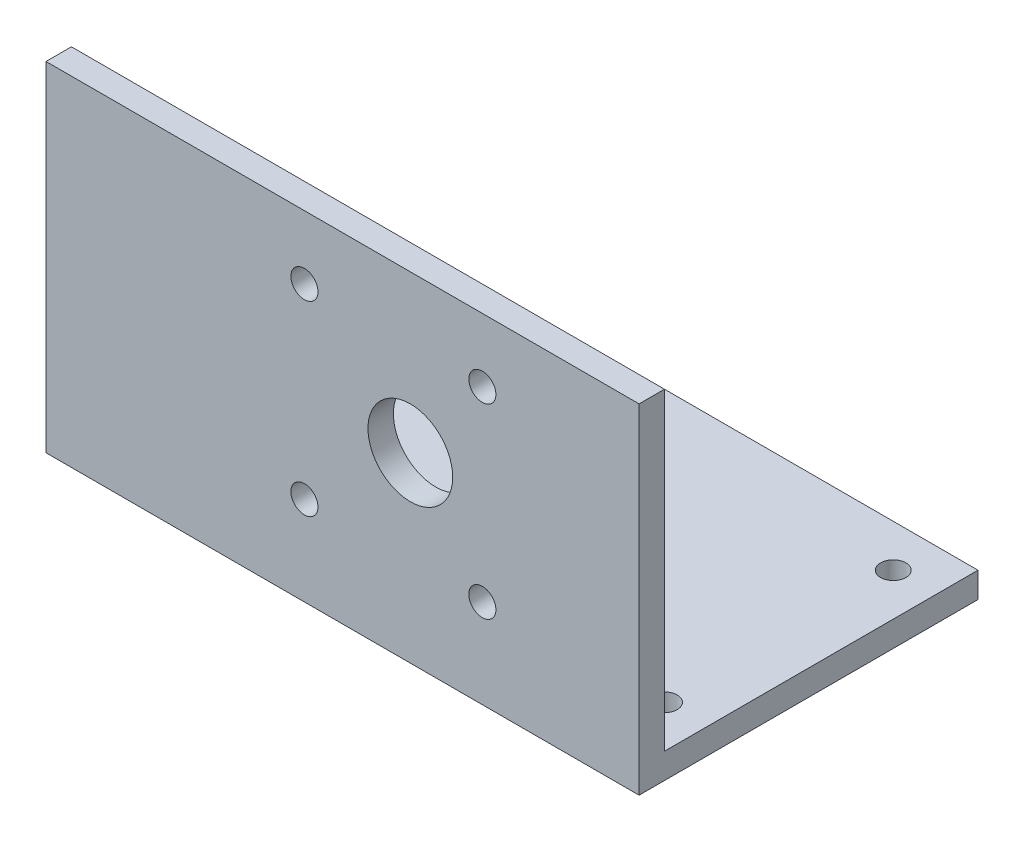
ISO-10303-21;
HEADER;
FILE_DESCRIPTION(('STEP AP214'),'2;1');
FILE_NAME('part.step','',(''),(''),'','','');
FILE_SCHEMA(('AUTOMOTIVE_DESIGN { 1 0 10303 214 1 1 1 1 }'));
ENDSEC;
DATA;
#1=APPLICATION_CONTEXT('core data for automotive mechanical design processes');
#2=APPLICATION_PROTOCOL_DEFINITION('international standard','automotive_design',2000,#1);
#3=PRODUCT_CONTEXT('',#1,'mechanical');
#4=PRODUCT('Part','Part','',(#3));
#5=PRODUCT_RELATED_PRODUCT_CATEGORY('part','',(#4));
#6=PRODUCT_DEFINITION_FORMATION('','',#4);
#7=PRODUCT_DEFINITION_CONTEXT('part definition',#1,'design');
#8=PRODUCT_DEFINITION('design','',#6,#7);
#9=PRODUCT_DEFINITION_SHAPE('','',#8);
#10=(LENGTH_UNIT() NAMED_UNIT(*) SI_UNIT(.MILLI.,.METRE.));
#11=(NAMED_UNIT(*) PLANE_ANGLE_UNIT() SI_UNIT($,.RADIAN.));
#12=(NAMED_UNIT(*) SI_UNIT($,.STERADIAN.) SOLID_ANGLE_UNIT());
#13=UNCERTAINTY_MEASURE_WITH_UNIT(LENGTH_MEASURE(1.E-05),#10,'distance_accuracy_value','');
#14=(GEOMETRIC_REPRESENTATION_CONTEXT(3) GLOBAL_UNCERTAINTY_ASSIGNED_CONTEXT((#13)) GLOBAL_UNIT_ASSIGNED_CONTEXT((#10,
#11,#12)) REPRESENTATION_CONTEXT('',''));
#15=CARTESIAN_POINT('',(0.,0.,0.));
#16=DIRECTION('',(0.,0.,1.));
#17=DIRECTION('',(1.,0.,0.));
#18=AXIS2_PLACEMENT_3D('',#15,#16,#17);
#19=CARTESIAN_POINT('',(70.,-17.,-20.));
#20=DIRECTION('',(0.,0.,1.));
#21=DIRECTION('',(0.,-1.,0.));
#22=AXIS2_PLACEMENT_3D('',#19,#20,#21);
#23=PLANE('',#22);
#24=DIRECTION('',(0.,1.,0.));
#25=VECTOR('',#24,1.);
#26=CARTESIAN_POINT('',(0.,-17.,-20.));
#27=LINE('',#26,#25);
#28=CARTESIAN_POINT('',(0.,-20.,-20.));
#29=VERTEX_POINT('',#28);
#30=CARTESIAN_POINT('',(0.,-17.,-20.));
#31=VERTEX_POINT('',#30);
#32=EDGE_CURVE('E119',#29,#31,#27,.T.);
#33=ORIENTED_EDGE('',*,*,#32,.T.);
#34=DIRECTION('',(-1.,0.,0.));
#35=VECTOR('',#34,1.);
#36=CARTESIAN_POINT('',(70.,-17.,-20.));
#37=LINE('',#36,#35);
#38=CARTESIAN_POINT('',(70.,-17.,-20.));
#39=VERTEX_POINT('',#38);
#40=EDGE_CURVE('E11',#39,#31,#37,.T.);
#41=ORIENTED_EDGE('',*,*,#40,.F.);
#42=DIRECTION('',(0.,1.,0.));
#43=VECTOR('',#42,1.);
#44=CARTESIAN_POINT('',(70.,-17.,-20.));
#45=LINE('',#44,#43);
#46=CARTESIAN_POINT('',(70.,-20.,-20.));
#47=VERTEX_POINT('',#46);
#48=EDGE_CURVE('E130',#47,#39,#45,.T.);
#49=ORIENTED_EDGE('',*,*,#48,.F.);
#50=DIRECTION('',(-1.,0.,0.));
#51=VECTOR('',#50,1.);
#52=CARTESIAN_POINT('',(70.,-20.,-20.));
#53=LINE('',#52,#51);
#54=EDGE_CURVE('E115',#47,#29,#53,.T.);
#55=ORIENTED_EDGE('',*,*,#54,.T.);
#56=EDGE_LOOP('',(#33,#41,#49,#55));
#57=FACE_BOUND('',#56,.T.);
#58=ADVANCED_FACE('F35',(#57),#23,.F.);
#59=CARTESIAN_POINT('',(70.,-17.,-20.));
#60=DIRECTION('',(0.,-1.,0.));
#61=DIRECTION('',(0.,0.,-1.));
#62=AXIS2_PLACEMENT_3D('',#59,#60,#61);
#63=PLANE('',#62);
#64=CARTESIAN_POINT('',(5.,-17.,12.));
#65=DIRECTION('',(0.,1.,0.));
#66=DIRECTION('',(0.,0.,-1.));
#67=AXIS2_PLACEMENT_3D('',#64,#65,#66);
#68=CIRCLE('',#67,1.5);
#69=CARTESIAN_POINT('',(5.,-17.,13.5));
#70=VERTEX_POINT('',#69);
#71=EDGE_CURVE('E296',#70,#70,#68,.T.);
#72=ORIENTED_EDGE('',*,*,#71,.F.);
#73=EDGE_LOOP('',(#72));
#74=FACE_BOUND('',#73,.T.);
#75=CARTESIAN_POINT('',(5.,-17.,-15.));
#76=DIRECTION('',(0.,1.,0.));
#77=DIRECTION('',(0.,0.,-1.));
#78=AXIS2_PLACEMENT_3D('',#75,#76,#77);
#79=CIRCLE('',#78,1.5);
#80=CARTESIAN_POINT('',(5.,-17.,-13.5));
#81=VERTEX_POINT('',#80);
#82=EDGE_CURVE('E298',#81,#81,#79,.T.);
#83=ORIENTED_EDGE('',*,*,#82,.F.);
#84=EDGE_LOOP('',(#83));
#85=FACE_BOUND('',#84,.T.);
#86=CARTESIAN_POINT('',(65.,-17.,-15.));
#87=DIRECTION('',(0.,1.,0.));
#88=DIRECTION('',(0.,0.,1.));
#89=AXIS2_PLACEMENT_3D('',#86,#87,#88);
#90=CIRCLE('',#89,1.5);
#91=CARTESIAN_POINT('',(65.,-17.,-13.5));
#92=VERTEX_POINT('',#91);
#93=EDGE_CURVE('E306',#92,#92,#90,.T.);
#94=ORIENTED_EDGE('',*,*,#93,.F.);
#95=EDGE_LOOP('',(#94));
#96=FACE_BOUND('',#95,.T.);
#97=CARTESIAN_POINT('',(65.,-17.,12.));
#98=DIRECTION('',(0.,1.,0.));
#99=DIRECTION('',(0.,0.,1.));
#100=AXIS2_PLACEMENT_3D('',#97,#98,#99);
#101=CIRCLE('',#100,1.5);
#102=CARTESIAN_POINT('',(65.,-17.,13.5));
#103=VERTEX_POINT('',#102);
#104=EDGE_CURVE('E312',#103,#103,#101,.T.);
#105=ORIENTED_EDGE('',*,*,#104,.F.);
#106=EDGE_LOOP('',(#105));
#107=FACE_BOUND('',#106,.T.);
#108=DIRECTION('',(0.,0.,1.));
#109=VECTOR('',#108,1.);
#110=CARTESIAN_POINT('',(0.,-17.,-20.));
#111=LINE('',#110,#109);
#112=CARTESIAN_POINT('',(0.,-17.,17.));
#113=VERTEX_POINT('',#112);
#114=EDGE_CURVE('E122',#31,#113,#111,.T.);
#115=ORIENTED_EDGE('',*,*,#114,.T.);
#116=DIRECTION('',(-1.,0.,0.));
#117=VECTOR('',#116,1.);
#118=CARTESIAN_POINT('',(70.,-17.,17.));
#119=LINE('',#118,#117);
#120=CARTESIAN_POINT('',(70.,-17.,17.));
#121=VERTEX_POINT('',#120);
#122=EDGE_CURVE('E43',#121,#113,#119,.T.);
#123=ORIENTED_EDGE('',*,*,#122,.F.);
#124=DIRECTION('',(0.,0.,1.));
#125=VECTOR('',#124,1.);
#126=CARTESIAN_POINT('',(70.,-17.,-20.));
#127=LINE('',#126,#125);
#128=EDGE_CURVE('E88',#39,#121,#127,.T.);
#129=ORIENTED_EDGE('',*,*,#128,.F.);
#130=ORIENTED_EDGE('',*,*,#40,.T.);
#131=EDGE_LOOP('',(#115,#123,#129,#130));
#132=FACE_BOUND('',#131,.T.);
#133=ADVANCED_FACE('F160',(#74,#85,#96,#107,#132),#63,.F.);
#134=CARTESIAN_POINT('',(70.,20.,17.));
#135=DIRECTION('',(0.,0.,1.));
#136=DIRECTION('',(0.,-1.,0.));
#137=AXIS2_PLACEMENT_3D('',#134,#135,#136);
#138=PLANE('',#137);
#139=CARTESIAN_POINT('',(51.5,-9.50000000000001,17.));
#140=DIRECTION('',(0.,0.,1.));
#141=DIRECTION('',(0.,-1.,0.));
#142=AXIS2_PLACEMENT_3D('',#139,#140,#141);
#143=CIRCLE('',#142,1.6);
#144=CARTESIAN_POINT('',(51.5,-11.1,17.));
#145=VERTEX_POINT('',#144);
#146=EDGE_CURVE('E321',#145,#145,#143,.F.);
#147=ORIENTED_EDGE('',*,*,#146,.F.);
#148=EDGE_LOOP('',(#147));
#149=FACE_BOUND('',#148,.T.);
#150=CARTESIAN_POINT('',(30.5,-9.50000000000001,17.));
#151=DIRECTION('',(0.,0.,1.));
#152=DIRECTION('',(0.,-1.,0.));
#153=AXIS2_PLACEMENT_3D('',#150,#151,#152);
#154=CIRCLE('',#153,1.6);
#155=CARTESIAN_POINT('',(30.5,-11.1,17.));
#156=VERTEX_POINT('',#155);
#157=EDGE_CURVE('E327',#156,#156,#154,.F.);
#158=ORIENTED_EDGE('',*,*,#157,.F.);
#159=EDGE_LOOP('',(#158));
#160=FACE_BOUND('',#159,.T.);
#161=CARTESIAN_POINT('',(30.5,12.5,17.));
#162=DIRECTION('',(0.,0.,1.));
#163=DIRECTION('',(0.,-1.,0.));
#164=AXIS2_PLACEMENT_3D('',#161,#162,#163);
#165=CIRCLE('',#164,1.6);
#166=CARTESIAN_POINT('',(30.5,10.9,17.));
#167=VERTEX_POINT('',#166);
#168=EDGE_CURVE('E333',#167,#167,#165,.F.);
#169=ORIENTED_EDGE('',*,*,#168,.F.);
#170=EDGE_LOOP('',(#169));
#171=FACE_BOUND('',#170,.T.);
#172=CARTESIAN_POINT('',(51.5,12.5,17.));
#173=DIRECTION('',(0.,0.,1.));
#174=DIRECTION('',(0.,-1.,0.));
#175=AXIS2_PLACEMENT_3D('',#172,#173,#174);
#176=CIRCLE('',#175,1.6);
#177=CARTESIAN_POINT('',(51.5,10.9,17.));
#178=VERTEX_POINT('',#177);
#179=EDGE_CURVE('E339',#178,#178,#176,.F.);
#180=ORIENTED_EDGE('',*,*,#179,.F.);
#181=EDGE_LOOP('',(#180));
#182=FACE_BOUND('',#181,.T.);
#183=CARTESIAN_POINT('',(43.,1.49999999999999,17.));
#184=DIRECTION('',(0.,0.,1.));
#185=DIRECTION('',(0.,-1.,0.));
#186=AXIS2_PLACEMENT_3D('',#183,#184,#185);
#187=CIRCLE('',#186,5.);
#188=CARTESIAN_POINT('',(43.,-3.50000000000001,17.));
#189=VERTEX_POINT('',#188);
#190=EDGE_CURVE('E123',#189,#189,#187,.F.);
#191=ORIENTED_EDGE('',*,*,#190,.F.);
#192=EDGE_LOOP('',(#191));
#193=FACE_BOUND('',#192,.T.);
#194=DIRECTION('',(0.,1.,0.));
#195=VECTOR('',#194,1.);
#196=CARTESIAN_POINT('',(0.,20.,17.));
#197=LINE('',#196,#195);
#198=CARTESIAN_POINT('',(0.,20.,17.));
#199=VERTEX_POINT('',#198);
#200=EDGE_CURVE('E125',#113,#199,#197,.T.);
#201=ORIENTED_EDGE('',*,*,#200,.T.);
#202=DIRECTION('',(-1.,0.,0.));
#203=VECTOR('',#202,1.);
#204=CARTESIAN_POINT('',(70.,20.,17.));
#205=LINE('',#204,#203);
#206=CARTESIAN_POINT('',(70.,20.,17.));
#207=VERTEX_POINT('',#206);
#208=EDGE_CURVE('E110',#207,#199,#205,.T.);
#209=ORIENTED_EDGE('',*,*,#208,.F.);
#210=DIRECTION('',(0.,1.,0.));
#211=VECTOR('',#210,1.);
#212=CARTESIAN_POINT('',(70.,20.,17.));
#213=LINE('',#212,#211);
#214=EDGE_CURVE('E101',#121,#207,#213,.T.);
#215=ORIENTED_EDGE('',*,*,#214,.F.);
#216=ORIENTED_EDGE('',*,*,#122,.T.);
#217=EDGE_LOOP('',(#201,#209,#215,#216));
#218=FACE_BOUND('',#217,.T.);
#219=ADVANCED_FACE('F136',(#149,#160,#171,#182,#193,#218),#138,.F.);
#220=CARTESIAN_POINT('',(70.,20.,20.));
#221=DIRECTION('',(0.,-1.,0.));
#222=DIRECTION('',(0.,0.,-1.));
#223=AXIS2_PLACEMENT_3D('',#220,#221,#222);
#224=PLANE('',#223);
#225=DIRECTION('',(0.,0.,1.));
#226=VECTOR('',#225,1.);
#227=CARTESIAN_POINT('',(0.,20.,20.));
#228=LINE('',#227,#226);
#229=CARTESIAN_POINT('',(0.,20.,20.));
#230=VERTEX_POINT('',#229);
#231=EDGE_CURVE('E109',#199,#230,#228,.T.);
#232=ORIENTED_EDGE('',*,*,#231,.T.);
#233=DIRECTION('',(-1.,0.,0.));
#234=VECTOR('',#233,1.);
#235=CARTESIAN_POINT('',(70.,20.,20.));
#236=LINE('',#235,#234);
#237=CARTESIAN_POINT('',(70.,20.,20.));
#238=VERTEX_POINT('',#237);
#239=EDGE_CURVE('E106',#238,#230,#236,.T.);
#240=ORIENTED_EDGE('',*,*,#239,.F.);
#241=DIRECTION('',(0.,0.,1.));
#242=VECTOR('',#241,1.);
#243=CARTESIAN_POINT('',(70.,20.,20.));
#244=LINE('',#243,#242);
#245=EDGE_CURVE('E95',#207,#238,#244,.T.);
#246=ORIENTED_EDGE('',*,*,#245,.F.);
#247=ORIENTED_EDGE('',*,*,#208,.T.);
#248=EDGE_LOOP('',(#232,#240,#246,#247));
#249=FACE_BOUND('',#248,.T.);
#250=ADVANCED_FACE('F107',(#249),#224,.F.);
#251=CARTESIAN_POINT('',(70.,20.,20.));
#252=DIRECTION('',(0.,0.,-1.));
#253=DIRECTION('',(0.,1.,0.));
#254=AXIS2_PLACEMENT_3D('',#251,#252,#253);
#255=PLANE('',#254);
#256=CARTESIAN_POINT('',(51.5,-9.50000000000001,20.));
#257=DIRECTION('',(0.,0.,1.));
#258=DIRECTION('',(1.,0.,0.));
#259=AXIS2_PLACEMENT_3D('',#256,#257,#258);
#260=CIRCLE('',#259,1.6);
#261=CARTESIAN_POINT('',(53.1,-9.50000000000001,20.));
#262=VERTEX_POINT('',#261);
#263=EDGE_CURVE('E318',#262,#262,#260,.T.);
#264=ORIENTED_EDGE('',*,*,#263,.F.);
#265=EDGE_LOOP('',(#264));
#266=FACE_BOUND('',#265,.T.);
#267=CARTESIAN_POINT('',(30.5,-9.50000000000001,20.));
#268=DIRECTION('',(0.,0.,1.));
#269=DIRECTION('',(1.,0.,0.));
#270=AXIS2_PLACEMENT_3D('',#267,#268,#269);
#271=CIRCLE('',#270,1.6);
#272=CARTESIAN_POINT('',(32.1,-9.50000000000001,20.));
#273=VERTEX_POINT('',#272);
#274=EDGE_CURVE('E324',#273,#273,#271,.T.);
#275=ORIENTED_EDGE('',*,*,#274,.F.);
#276=EDGE_LOOP('',(#275));
#277=FACE_BOUND('',#276,.T.);
#278=CARTESIAN_POINT('',(30.5,12.5,20.));
#279=DIRECTION('',(0.,0.,1.));
#280=DIRECTION('',(1.,0.,0.));
#281=AXIS2_PLACEMENT_3D('',#278,#279,#280);
#282=CIRCLE('',#281,1.6);
#283=CARTESIAN_POINT('',(32.1,12.5,20.));
#284=VERTEX_POINT('',#283);
#285=EDGE_CURVE('E330',#284,#284,#282,.T.);
#286=ORIENTED_EDGE('',*,*,#285,.F.);
#287=EDGE_LOOP('',(#286));
#288=FACE_BOUND('',#287,.T.);
#289=CARTESIAN_POINT('',(51.5,12.5,20.));
#290=DIRECTION('',(0.,0.,1.));
#291=DIRECTION('',(1.,0.,0.));
#292=AXIS2_PLACEMENT_3D('',#289,#290,#291);
#293=CIRCLE('',#292,1.6);
#294=CARTESIAN_POINT('',(53.1,12.5,20.));
#295=VERTEX_POINT('',#294);
#296=EDGE_CURVE('E336',#295,#295,#293,.T.);
#297=ORIENTED_EDGE('',*,*,#296,.F.);
#298=EDGE_LOOP('',(#297));
#299=FACE_BOUND('',#298,.T.);
#300=CARTESIAN_POINT('',(43.,1.49999999999999,20.));
#301=DIRECTION('',(0.,0.,1.));
#302=DIRECTION('',(1.,0.,0.));
#303=AXIS2_PLACEMENT_3D('',#300,#301,#302);
#304=CIRCLE('',#303,5.);
#305=CARTESIAN_POINT('',(48.,1.49999999999999,20.));
#306=VERTEX_POINT('',#305);
#307=EDGE_CURVE('E342',#306,#306,#304,.T.);
#308=ORIENTED_EDGE('',*,*,#307,.F.);
#309=EDGE_LOOP('',(#308));
#310=FACE_BOUND('',#309,.T.);
#311=DIRECTION('',(0.,-1.,0.));
#312=VECTOR('',#311,1.);
#313=CARTESIAN_POINT('',(0.,20.,20.));
#314=LINE('',#313,#312);
#315=CARTESIAN_POINT('',(0.,-20.,20.));
#316=VERTEX_POINT('',#315);
#317=EDGE_CURVE('E74',#230,#316,#314,.T.);
#318=ORIENTED_EDGE('',*,*,#317,.T.);
#319=DIRECTION('',(-1.,0.,0.));
#320=VECTOR('',#319,1.);
#321=CARTESIAN_POINT('',(70.,-20.,20.));
#322=LINE('',#321,#320);
#323=CARTESIAN_POINT('',(70.,-20.,20.));
#324=VERTEX_POINT('',#323);
#325=EDGE_CURVE('E111',#324,#316,#322,.T.);
#326=ORIENTED_EDGE('',*,*,#325,.F.);
#327=DIRECTION('',(0.,-1.,0.));
#328=VECTOR('',#327,1.);
#329=CARTESIAN_POINT('',(70.,20.,20.));
#330=LINE('',#329,#328);
#331=EDGE_CURVE('E99',#238,#324,#330,.T.);
#332=ORIENTED_EDGE('',*,*,#331,.F.);
#333=ORIENTED_EDGE('',*,*,#239,.T.);
#334=EDGE_LOOP('',(#318,#326,#332,#333));
#335=FACE_BOUND('',#334,.T.);
#336=ADVANCED_FACE('F113',(#266,#277,#288,#299,#310,#335),#255,.F.);
#337=CARTESIAN_POINT('',(70.,-20.,20.));
#338=DIRECTION('',(0.,1.,0.));
#339=DIRECTION('',(0.,0.,1.));
#340=AXIS2_PLACEMENT_3D('',#337,#338,#339);
#341=PLANE('',#340);
#342=CARTESIAN_POINT('',(5.,-20.,12.));
#343=DIRECTION('',(0.,1.,0.));
#344=DIRECTION('',(0.,0.,1.));
#345=AXIS2_PLACEMENT_3D('',#342,#343,#344);
#346=CIRCLE('',#345,1.5);
#347=CARTESIAN_POINT('',(5.,-20.,13.5));
#348=VERTEX_POINT('',#347);
#349=EDGE_CURVE('E294',#348,#348,#346,.F.);
#350=ORIENTED_EDGE('',*,*,#349,.F.);
#351=EDGE_LOOP('',(#350));
#352=FACE_BOUND('',#351,.T.);
#353=CARTESIAN_POINT('',(5.,-20.,-15.));
#354=DIRECTION('',(0.,1.,0.));
#355=DIRECTION('',(0.,0.,1.));
#356=AXIS2_PLACEMENT_3D('',#353,#354,#355);
#357=CIRCLE('',#356,1.5);
#358=CARTESIAN_POINT('',(5.,-20.,-13.5));
#359=VERTEX_POINT('',#358);
#360=EDGE_CURVE('E303',#359,#359,#357,.F.);
#361=ORIENTED_EDGE('',*,*,#360,.F.);
#362=EDGE_LOOP('',(#361));
#363=FACE_BOUND('',#362,.T.);
#364=CARTESIAN_POINT('',(65.,-20.,-15.));
#365=DIRECTION('',(0.,1.,0.));
#366=DIRECTION('',(0.,0.,1.));
#367=AXIS2_PLACEMENT_3D('',#364,#365,#366);
#368=CIRCLE('',#367,1.5);
#369=CARTESIAN_POINT('',(65.,-20.,-13.5));
#370=VERTEX_POINT('',#369);
#371=EDGE_CURVE('E309',#370,#370,#368,.F.);
#372=ORIENTED_EDGE('',*,*,#371,.F.);
#373=EDGE_LOOP('',(#372));
#374=FACE_BOUND('',#373,.T.);
#375=CARTESIAN_POINT('',(65.,-20.,12.));
#376=DIRECTION('',(0.,1.,0.));
#377=DIRECTION('',(0.,0.,1.));
#378=AXIS2_PLACEMENT_3D('',#375,#376,#377);
#379=CIRCLE('',#378,1.5);
#380=CARTESIAN_POINT('',(65.,-20.,13.5));
#381=VERTEX_POINT('',#380);
#382=EDGE_CURVE('E315',#381,#381,#379,.F.);
#383=ORIENTED_EDGE('',*,*,#382,.F.);
#384=EDGE_LOOP('',(#383));
#385=FACE_BOUND('',#384,.T.);
#386=DIRECTION('',(0.,0.,-1.));
#387=VECTOR('',#386,1.);
#388=CARTESIAN_POINT('',(0.,-20.,20.));
#389=LINE('',#388,#387);
#390=EDGE_CURVE('E80',#316,#29,#389,.T.);
#391=ORIENTED_EDGE('',*,*,#390,.T.);
#392=ORIENTED_EDGE('',*,*,#54,.F.);
#393=DIRECTION('',(0.,0.,-1.));
#394=VECTOR('',#393,1.);
#395=CARTESIAN_POINT('',(70.,-20.,20.));
#396=LINE('',#395,#394);
#397=EDGE_CURVE('E51',#324,#47,#396,.T.);
#398=ORIENTED_EDGE('',*,*,#397,.F.);
#399=ORIENTED_EDGE('',*,*,#325,.T.);
#400=EDGE_LOOP('',(#391,#392,#398,#399));
#401=FACE_BOUND('',#400,.T.);
#402=ADVANCED_FACE('F143',(#352,#363,#374,#385,#401),#341,.F.);
#403=CARTESIAN_POINT('',(70.,0.,0.));
#404=DIRECTION('',(1.,0.,0.));
#405=DIRECTION('',(0.,0.,-1.));
#406=AXIS2_PLACEMENT_3D('',#403,#404,#405);
#407=PLANE('',#406);
#408=ORIENTED_EDGE('',*,*,#48,.T.);
#409=ORIENTED_EDGE('',*,*,#128,.T.);
#410=ORIENTED_EDGE('',*,*,#214,.T.);
#411=ORIENTED_EDGE('',*,*,#245,.T.);
#412=ORIENTED_EDGE('',*,*,#331,.T.);
#413=ORIENTED_EDGE('',*,*,#397,.T.);
#414=EDGE_LOOP('',(#408,#409,#410,#411,#412,#413));
#415=FACE_BOUND('',#414,.T.);
#416=ADVANCED_FACE('F97',(#415),#407,.T.);
#417=CARTESIAN_POINT('',(0.,0.,0.));
#418=DIRECTION('',(1.,0.,0.));
#419=DIRECTION('',(0.,0.,-1.));
#420=AXIS2_PLACEMENT_3D('',#417,#418,#419);
#421=PLANE('',#420);
#422=ORIENTED_EDGE('',*,*,#32,.F.);
#423=ORIENTED_EDGE('',*,*,#390,.F.);
#424=ORIENTED_EDGE('',*,*,#317,.F.);
#425=ORIENTED_EDGE('',*,*,#231,.F.);
#426=ORIENTED_EDGE('',*,*,#200,.F.);
#427=ORIENTED_EDGE('',*,*,#114,.F.);
#428=EDGE_LOOP('',(#422,#423,#424,#425,#426,#427));
#429=FACE_BOUND('',#428,.T.);
#430=ADVANCED_FACE('F139',(#429),#421,.F.);
#431=CARTESIAN_POINT('',(43.,1.49999999999999,2.85786437626906));
#432=DIRECTION('',(0.,0.,1.));
#433=DIRECTION('',(1.,0.,0.));
#434=AXIS2_PLACEMENT_3D('',#431,#432,#433);
#435=CYLINDRICAL_SURFACE('',#434,5.);
#436=ORIENTED_EDGE('',*,*,#190,.T.);
#437=EDGE_LOOP('',(#436));
#438=FACE_BOUND('',#437,.T.);
#439=ORIENTED_EDGE('',*,*,#307,.T.);
#440=EDGE_LOOP('',(#439));
#441=FACE_BOUND('',#440,.T.);
#442=ADVANCED_FACE('F200',(#438,#441),#435,.F.);
#443=CARTESIAN_POINT('',(51.5,12.5,2.85786437626906));
#444=DIRECTION('',(0.,0.,1.));
#445=DIRECTION('',(1.,0.,0.));
#446=AXIS2_PLACEMENT_3D('',#443,#444,#445);
#447=CYLINDRICAL_SURFACE('',#446,1.6);
#448=ORIENTED_EDGE('',*,*,#179,.T.);
#449=EDGE_LOOP('',(#448));
#450=FACE_BOUND('',#449,.T.);
#451=ORIENTED_EDGE('',*,*,#296,.T.);
#452=EDGE_LOOP('',(#451));
#453=FACE_BOUND('',#452,.T.);
#454=ADVANCED_FACE('F205',(#450,#453),#447,.F.);
#455=CARTESIAN_POINT('',(30.5,12.5,2.85786437626906));
#456=DIRECTION('',(0.,0.,1.));
#457=DIRECTION('',(1.,0.,0.));
#458=AXIS2_PLACEMENT_3D('',#455,#456,#457);
#459=CYLINDRICAL_SURFACE('',#458,1.6);
#460=ORIENTED_EDGE('',*,*,#168,.T.);
#461=EDGE_LOOP('',(#460));
#462=FACE_BOUND('',#461,.T.);
#463=ORIENTED_EDGE('',*,*,#285,.T.);
#464=EDGE_LOOP('',(#463));
#465=FACE_BOUND('',#464,.T.);
#466=ADVANCED_FACE('F213',(#462,#465),#459,.F.);
#467=CARTESIAN_POINT('',(30.5,-9.50000000000001,2.85786437626906));
#468=DIRECTION('',(0.,0.,1.));
#469=DIRECTION('',(1.,0.,0.));
#470=AXIS2_PLACEMENT_3D('',#467,#468,#469);
#471=CYLINDRICAL_SURFACE('',#470,1.6);
#472=ORIENTED_EDGE('',*,*,#157,.T.);
#473=EDGE_LOOP('',(#472));
#474=FACE_BOUND('',#473,.T.);
#475=ORIENTED_EDGE('',*,*,#274,.T.);
#476=EDGE_LOOP('',(#475));
#477=FACE_BOUND('',#476,.T.);
#478=ADVANCED_FACE('F221',(#474,#477),#471,.F.);
#479=CARTESIAN_POINT('',(51.5,-9.50000000000001,2.85786437626906));
#480=DIRECTION('',(0.,0.,1.));
#481=DIRECTION('',(1.,0.,0.));
#482=AXIS2_PLACEMENT_3D('',#479,#480,#481);
#483=CYLINDRICAL_SURFACE('',#482,1.6);
#484=ORIENTED_EDGE('',*,*,#146,.T.);
#485=EDGE_LOOP('',(#484));
#486=FACE_BOUND('',#485,.T.);
#487=ORIENTED_EDGE('',*,*,#263,.T.);
#488=EDGE_LOOP('',(#487));
#489=FACE_BOUND('',#488,.T.);
#490=ADVANCED_FACE('F229',(#486,#489),#483,.F.);
#491=CARTESIAN_POINT('',(65.,-24.2426406871193,12.));
#492=DIRECTION('',(0.,1.,0.));
#493=DIRECTION('',(0.,0.,1.));
#494=AXIS2_PLACEMENT_3D('',#491,#492,#493);
#495=CYLINDRICAL_SURFACE('',#494,1.5);
#496=CARTESIAN_POINT('',(65.,-20.,13.5));
#497=CARTESIAN_POINT('',(65.,-19.96875,13.5));
#498=CARTESIAN_POINT('',(65.,-19.9375,13.5));
#499=CARTESIAN_POINT('',(65.,-19.875,13.5));
#500=CARTESIAN_POINT('',(65.,-19.84375,13.5));
#501=CARTESIAN_POINT('',(65.,-19.78125,13.5));
#502=CARTESIAN_POINT('',(65.,-19.75,13.5));
#503=CARTESIAN_POINT('',(65.,-19.6875,13.5));
#504=CARTESIAN_POINT('',(65.,-19.65625,13.5));
#505=CARTESIAN_POINT('',(65.,-19.59375,13.5));
#506=CARTESIAN_POINT('',(65.,-19.5625,13.5));
#507=CARTESIAN_POINT('',(65.,-19.5,13.5));
#508=CARTESIAN_POINT('',(65.,-19.46875,13.5));
#509=CARTESIAN_POINT('',(65.,-19.40625,13.5));
#510=CARTESIAN_POINT('',(65.,-19.375,13.5));
#511=CARTESIAN_POINT('',(65.,-19.3125,13.5));
#512=CARTESIAN_POINT('',(65.,-19.28125,13.5));
#513=CARTESIAN_POINT('',(65.,-19.21875,13.5));
#514=CARTESIAN_POINT('',(65.,-19.1875,13.5));
#515=CARTESIAN_POINT('',(65.,-19.125,13.5));
#516=CARTESIAN_POINT('',(65.,-19.09375,13.5));
#517=CARTESIAN_POINT('',(65.,-19.03125,13.5));
#518=CARTESIAN_POINT('',(65.,-19.,13.5));
#519=CARTESIAN_POINT('',(65.,-18.9375,13.5));
#520=CARTESIAN_POINT('',(65.,-18.90625,13.5));
#521=CARTESIAN_POINT('',(65.,-18.84375,13.5));
#522=CARTESIAN_POINT('',(65.,-18.8125,13.5));
#523=CARTESIAN_POINT('',(65.,-18.75,13.5));
#524=CARTESIAN_POINT('',(65.,-18.71875,13.5));
#525=CARTESIAN_POINT('',(65.,-18.65625,13.5));
#526=CARTESIAN_POINT('',(65.,-18.625,13.5));
#527=CARTESIAN_POINT('',(65.,-18.5625,13.5));
#528=CARTESIAN_POINT('',(65.,-18.53125,13.5));
#529=CARTESIAN_POINT('',(65.,-18.46875,13.5));
#530=CARTESIAN_POINT('',(65.,-18.4375,13.5));
#531=CARTESIAN_POINT('',(65.,-18.375,13.5));
#532=CARTESIAN_POINT('',(65.,-18.34375,13.5));
#533=CARTESIAN_POINT('',(65.,-18.28125,13.5));
#534=CARTESIAN_POINT('',(65.,-18.25,13.5));
#535=CARTESIAN_POINT('',(65.,-18.1875,13.5));
#536=CARTESIAN_POINT('',(65.,-18.15625,13.5));
#537=CARTESIAN_POINT('',(65.,-18.09375,13.5));
#538=CARTESIAN_POINT('',(65.,-18.0625,13.5));
#539=CARTESIAN_POINT('',(65.,-18.,13.5));
#540=CARTESIAN_POINT('',(65.,-17.96875,13.5));
#541=CARTESIAN_POINT('',(65.,-17.90625,13.5));
#542=CARTESIAN_POINT('',(65.,-17.875,13.5));
#543=CARTESIAN_POINT('',(65.,-17.8125,13.5));
#544=CARTESIAN_POINT('',(65.,-17.78125,13.5));
#545=CARTESIAN_POINT('',(65.,-17.71875,13.5));
#546=CARTESIAN_POINT('',(65.,-17.6875,13.5));
#547=CARTESIAN_POINT('',(65.,-17.625,13.5));
#548=CARTESIAN_POINT('',(65.,-17.59375,13.5));
#549=CARTESIAN_POINT('',(65.,-17.53125,13.5));
#550=CARTESIAN_POINT('',(65.,-17.5,13.5));
#551=CARTESIAN_POINT('',(65.,-17.4375,13.5));
#552=CARTESIAN_POINT('',(65.,-17.40625,13.5));
#553=CARTESIAN_POINT('',(65.,-17.34375,13.5));
#554=CARTESIAN_POINT('',(65.,-17.3125,13.5));
#555=CARTESIAN_POINT('',(65.,-17.25,13.5));
#556=CARTESIAN_POINT('',(65.,-17.21875,13.5));
#557=CARTESIAN_POINT('',(65.,-17.15625,13.5));
#558=CARTESIAN_POINT('',(65.,-17.125,13.5));
#559=CARTESIAN_POINT('',(65.,-17.0625,13.5));
#560=CARTESIAN_POINT('',(65.,-17.03125,13.5));
#561=CARTESIAN_POINT('',(65.,-17.,13.5));
#562=B_SPLINE_CURVE_WITH_KNOTS('',3,(#496,#497,#498,#499,#500,#501,#502,#503,#504,#505,#506,
#507,#508,#509,#510,#511,#512,#513,#514,#515,#516,#517,#518,#519,#520,#521,#522,#523,#524,#525,
#526,#527,#528,#529,#530,#531,#532,#533,#534,#535,#536,#537,#538,#539,#540,#541,#542,#543,#544,
#545,#546,#547,#548,#549,#550,#551,#552,#553,#554,#555,#556,#557,#558,#559,#560,#561),
.UNSPECIFIED.,.F.,.F.,(4,2,2,2,2,2,2,2,2,2,2,2,2,2,2,2,2,2,2,2,2,2,2,2,2,2,2,2,2,2,2,2,4),(0.,
0.0937500000000001,0.1875,0.28125,0.375,0.46875,0.5625,0.656250000000001,0.750000000000001,
0.843750000000001,0.937500000000001,1.03125,1.125,1.21875,1.3125,1.40625,1.5,1.59375,1.6875,
1.78125,1.875,1.96875,2.0625,2.15625,2.25,2.34375,2.4375,2.53125,2.625,2.71875,2.8125,2.90625,
3.),.UNSPECIFIED.);
#563=EDGE_CURVE('BSEAM236',#381,#103,#562,.T.);
#564=ORIENTED_EDGE('',*,*,#382,.T.);
#565=ORIENTED_EDGE('',*,*,#104,.T.);
#566=ORIENTED_EDGE('',*,*,#563,.T.);
#567=ORIENTED_EDGE('',*,*,#563,.F.);
#568=EDGE_LOOP('',(#564,#566,#565,#567));
#569=FACE_BOUND('',#568,.T.);
#570=ADVANCED_FACE('F236',(#569),#495,.F.);
#571=CARTESIAN_POINT('',(65.,-24.2426406871193,-15.));
#572=DIRECTION('',(0.,1.,0.));
#573=DIRECTION('',(0.,0.,1.));
#574=AXIS2_PLACEMENT_3D('',#571,#572,#573);
#575=CYLINDRICAL_SURFACE('',#574,1.5);
#576=CARTESIAN_POINT('',(65.,-20.,-13.5));
#577=CARTESIAN_POINT('',(65.,-19.96875,-13.5));
#578=CARTESIAN_POINT('',(65.,-19.9375,-13.5));
#579=CARTESIAN_POINT('',(65.,-19.875,-13.5));
#580=CARTESIAN_POINT('',(65.,-19.84375,-13.5));
#581=CARTESIAN_POINT('',(65.,-19.78125,-13.5));
#582=CARTESIAN_POINT('',(65.,-19.75,-13.5));
#583=CARTESIAN_POINT('',(65.,-19.6875,-13.5));
#584=CARTESIAN_POINT('',(65.,-19.65625,-13.5));
#585=CARTESIAN_POINT('',(65.,-19.59375,-13.5));
#586=CARTESIAN_POINT('',(65.,-19.5625,-13.5));
#587=CARTESIAN_POINT('',(65.,-19.5,-13.5));
#588=CARTESIAN_POINT('',(65.,-19.46875,-13.5));
#589=CARTESIAN_POINT('',(65.,-19.40625,-13.5));
#590=CARTESIAN_POINT('',(65.,-19.375,-13.5));
#591=CARTESIAN_POINT('',(65.,-19.3125,-13.5));
#592=CARTESIAN_POINT('',(65.,-19.28125,-13.5));
#593=CARTESIAN_POINT('',(65.,-19.21875,-13.5));
#594=CARTESIAN_POINT('',(65.,-19.1875,-13.5));
#595=CARTESIAN_POINT('',(65.,-19.125,-13.5));
#596=CARTESIAN_POINT('',(65.,-19.09375,-13.5));
#597=CARTESIAN_POINT('',(65.,-19.03125,-13.5));
#598=CARTESIAN_POINT('',(65.,-19.,-13.5));
#599=CARTESIAN_POINT('',(65.,-18.9375,-13.5));
#600=CARTESIAN_POINT('',(65.,-18.90625,-13.5));
#601=CARTESIAN_POINT('',(65.,-18.84375,-13.5));
#602=CARTESIAN_POINT('',(65.,-18.8125,-13.5));
#603=CARTESIAN_POINT('',(65.,-18.75,-13.5));
#604=CARTESIAN_POINT('',(65.,-18.71875,-13.5));
#605=CARTESIAN_POINT('',(65.,-18.65625,-13.5));
#606=CARTESIAN_POINT('',(65.,-18.625,-13.5));
#607=CARTESIAN_POINT('',(65.,-18.5625,-13.5));
#608=CARTESIAN_POINT('',(65.,-18.53125,-13.5));
#609=CARTESIAN_POINT('',(65.,-18.46875,-13.5));
#610=CARTESIAN_POINT('',(65.,-18.4375,-13.5));
#611=CARTESIAN_POINT('',(65.,-18.375,-13.5));
#612=CARTESIAN_POINT('',(65.,-18.34375,-13.5));
#613=CARTESIAN_POINT('',(65.,-18.28125,-13.5));
#614=CARTESIAN_POINT('',(65.,-18.25,-13.5));
#615=CARTESIAN_POINT('',(65.,-18.1875,-13.5));
#616=CARTESIAN_POINT('',(65.,-18.15625,-13.5));
#617=CARTESIAN_POINT('',(65.,-18.09375,-13.5));
#618=CARTESIAN_POINT('',(65.,-18.0625,-13.5));
#619=CARTESIAN_POINT('',(65.,-18.,-13.5));
#620=CARTESIAN_POINT('',(65.,-17.96875,-13.5));
#621=CARTESIAN_POINT('',(65.,-17.90625,-13.5));
#622=CARTESIAN_POINT('',(65.,-17.875,-13.5));
#623=CARTESIAN_POINT('',(65.,-17.8125,-13.5));
#624=CARTESIAN_POINT('',(65.,-17.78125,-13.5));
#625=CARTESIAN_POINT('',(65.,-17.71875,-13.5));
#626=CARTESIAN_POINT('',(65.,-17.6875,-13.5));
#627=CARTESIAN_POINT('',(65.,-17.625,-13.5));
#628=CARTESIAN_POINT('',(65.,-17.59375,-13.5));
#629=CARTESIAN_POINT('',(65.,-17.53125,-13.5));
#630=CARTESIAN_POINT('',(65.,-17.5,-13.5));
#631=CARTESIAN_POINT('',(65.,-17.4375,-13.5));
#632=CARTESIAN_POINT('',(65.,-17.40625,-13.5));
#633=CARTESIAN_POINT('',(65.,-17.34375,-13.5));
#634=CARTESIAN_POINT('',(65.,-17.3125,-13.5));
#635=CARTESIAN_POINT('',(65.,-17.25,-13.5));
#636=CARTESIAN_POINT('',(65.,-17.21875,-13.5));
#637=CARTESIAN_POINT('',(65.,-17.15625,-13.5));
#638=CARTESIAN_POINT('',(65.,-17.125,-13.5));
#639=CARTESIAN_POINT('',(65.,-17.0625,-13.5));
#640=CARTESIAN_POINT('',(65.,-17.03125,-13.5));
#641=CARTESIAN_POINT('',(65.,-17.,-13.5));
#642=B_SPLINE_CURVE_WITH_KNOTS('',3,(#576,#577,#578,#579,#580,#581,#582,#583,#584,#585,#586,
#587,#588,#589,#590,#591,#592,#593,#594,#595,#596,#597,#598,#599,#600,#601,#602,#603,#604,#605,
#606,#607,#608,#609,#610,#611,#612,#613,#614,#615,#616,#617,#618,#619,#620,#621,#622,#623,#624,
#625,#626,#627,#628,#629,#630,#631,#632,#633,#634,#635,#636,#637,#638,#639,#640,#641),
.UNSPECIFIED.,.F.,.F.,(4,2,2,2,2,2,2,2,2,2,2,2,2,2,2,2,2,2,2,2,2,2,2,2,2,2,2,2,2,2,2,2,4),(0.,
0.0937500000000001,0.1875,0.28125,0.375,0.46875,0.5625,0.656250000000001,0.750000000000001,
0.843750000000001,0.937500000000001,1.03125,1.125,1.21875,1.3125,1.40625,1.5,1.59375,1.6875,
1.78125,1.875,1.96875,2.0625,2.15625,2.25,2.34375,2.4375,2.53125,2.625,2.71875,2.8125,2.90625,
3.),.UNSPECIFIED.);
#643=EDGE_CURVE('BSEAM243',#370,#92,#642,.T.);
#644=ORIENTED_EDGE('',*,*,#371,.T.);
#645=ORIENTED_EDGE('',*,*,#93,.T.);
#646=ORIENTED_EDGE('',*,*,#643,.T.);
#647=ORIENTED_EDGE('',*,*,#643,.F.);
#648=EDGE_LOOP('',(#644,#646,#645,#647));
#649=FACE_BOUND('',#648,.T.);
#650=ADVANCED_FACE('F243',(#649),#575,.F.);
#651=CARTESIAN_POINT('',(5.,-24.2426406871193,-15.));
#652=DIRECTION('',(0.,1.,0.));
#653=DIRECTION('',(0.,0.,1.));
#654=AXIS2_PLACEMENT_3D('',#651,#652,#653);
#655=CYLINDRICAL_SURFACE('',#654,1.5);
#656=CARTESIAN_POINT('',(5.,-20.,-13.5));
#657=CARTESIAN_POINT('',(5.,-19.96875,-13.5));
#658=CARTESIAN_POINT('',(5.,-19.9375,-13.5));
#659=CARTESIAN_POINT('',(5.,-19.875,-13.5));
#660=CARTESIAN_POINT('',(5.,-19.84375,-13.5));
#661=CARTESIAN_POINT('',(5.,-19.78125,-13.5));
#662=CARTESIAN_POINT('',(5.,-19.75,-13.5));
#663=CARTESIAN_POINT('',(5.,-19.6875,-13.5));
#664=CARTESIAN_POINT('',(5.,-19.65625,-13.5));
#665=CARTESIAN_POINT('',(5.,-19.59375,-13.5));
#666=CARTESIAN_POINT('',(5.,-19.5625,-13.5));
#667=CARTESIAN_POINT('',(5.,-19.5,-13.5));
#668=CARTESIAN_POINT('',(5.,-19.46875,-13.5));
#669=CARTESIAN_POINT('',(5.,-19.40625,-13.5));
#670=CARTESIAN_POINT('',(5.,-19.375,-13.5));
#671=CARTESIAN_POINT('',(5.,-19.3125,-13.5));
#672=CARTESIAN_POINT('',(5.,-19.28125,-13.5));
#673=CARTESIAN_POINT('',(5.,-19.21875,-13.5));
#674=CARTESIAN_POINT('',(5.,-19.1875,-13.5));
#675=CARTESIAN_POINT('',(5.,-19.125,-13.5));
#676=CARTESIAN_POINT('',(5.,-19.09375,-13.5));
#677=CARTESIAN_POINT('',(5.,-19.03125,-13.5));
#678=CARTESIAN_POINT('',(5.,-19.,-13.5));
#679=CARTESIAN_POINT('',(5.,-18.9375,-13.5));
#680=CARTESIAN_POINT('',(5.,-18.90625,-13.5));
#681=CARTESIAN_POINT('',(5.,-18.84375,-13.5));
#682=CARTESIAN_POINT('',(5.,-18.8125,-13.5));
#683=CARTESIAN_POINT('',(5.,-18.75,-13.5));
#684=CARTESIAN_POINT('',(5.,-18.71875,-13.5));
#685=CARTESIAN_POINT('',(5.,-18.65625,-13.5));
#686=CARTESIAN_POINT('',(5.,-18.625,-13.5));
#687=CARTESIAN_POINT('',(5.,-18.5625,-13.5));
#688=CARTESIAN_POINT('',(5.,-18.53125,-13.5));
#689=CARTESIAN_POINT('',(5.,-18.46875,-13.5));
#690=CARTESIAN_POINT('',(5.,-18.4375,-13.5));
#691=CARTESIAN_POINT('',(5.,-18.375,-13.5));
#692=CARTESIAN_POINT('',(5.,-18.34375,-13.5));
#693=CARTESIAN_POINT('',(5.,-18.28125,-13.5));
#694=CARTESIAN_POINT('',(5.,-18.25,-13.5));
#695=CARTESIAN_POINT('',(5.,-18.1875,-13.5));
#696=CARTESIAN_POINT('',(5.,-18.15625,-13.5));
#697=CARTESIAN_POINT('',(5.,-18.09375,-13.5));
#698=CARTESIAN_POINT('',(5.,-18.0625,-13.5));
#699=CARTESIAN_POINT('',(5.,-18.,-13.5));
#700=CARTESIAN_POINT('',(5.,-17.96875,-13.5));
#701=CARTESIAN_POINT('',(5.,-17.90625,-13.5));
#702=CARTESIAN_POINT('',(5.,-17.875,-13.5));
#703=CARTESIAN_POINT('',(5.,-17.8125,-13.5));
#704=CARTESIAN_POINT('',(5.,-17.78125,-13.5));
#705=CARTESIAN_POINT('',(5.,-17.71875,-13.5));
#706=CARTESIAN_POINT('',(5.,-17.6875,-13.5));
#707=CARTESIAN_POINT('',(5.,-17.625,-13.5));
#708=CARTESIAN_POINT('',(5.,-17.59375,-13.5));
#709=CARTESIAN_POINT('',(5.,-17.53125,-13.5));
#710=CARTESIAN_POINT('',(5.,-17.5,-13.5));
#711=CARTESIAN_POINT('',(5.,-17.4375,-13.5));
#712=CARTESIAN_POINT('',(5.,-17.40625,-13.5));
#713=CARTESIAN_POINT('',(5.,-17.34375,-13.5));
#714=CARTESIAN_POINT('',(5.,-17.3125,-13.5));
#715=CARTESIAN_POINT('',(5.,-17.25,-13.5));
#716=CARTESIAN_POINT('',(5.,-17.21875,-13.5));
#717=CARTESIAN_POINT('',(5.,-17.15625,-13.5));
#718=CARTESIAN_POINT('',(5.,-17.125,-13.5));
#719=CARTESIAN_POINT('',(5.,-17.0625,-13.5));
#720=CARTESIAN_POINT('',(5.,-17.03125,-13.5));
#721=CARTESIAN_POINT('',(5.,-17.,-13.5));
#722=B_SPLINE_CURVE_WITH_KNOTS('',3,(#656,#657,#658,#659,#660,#661,#662,#663,#664,#665,#666,
#667,#668,#669,#670,#671,#672,#673,#674,#675,#676,#677,#678,#679,#680,#681,#682,#683,#684,#685,
#686,#687,#688,#689,#690,#691,#692,#693,#694,#695,#696,#697,#698,#699,#700,#701,#702,#703,#704,
#705,#706,#707,#708,#709,#710,#711,#712,#713,#714,#715,#716,#717,#718,#719,#720,#721),
.UNSPECIFIED.,.F.,.F.,(4,2,2,2,2,2,2,2,2,2,2,2,2,2,2,2,2,2,2,2,2,2,2,2,2,2,2,2,2,2,2,2,4),(0.,
0.0937500000000001,0.1875,0.28125,0.375,0.46875,0.5625,0.656250000000001,0.750000000000001,
0.843750000000001,0.937500000000001,1.03125,1.125,1.21875,1.3125,1.40625,1.5,1.59375,1.6875,
1.78125,1.875,1.96875,2.0625,2.15625,2.25,2.34375,2.4375,2.53125,2.625,2.71875,2.8125,2.90625,
3.),.UNSPECIFIED.);
#723=EDGE_CURVE('BSEAM251',#359,#81,#722,.T.);
#724=ORIENTED_EDGE('',*,*,#360,.T.);
#725=ORIENTED_EDGE('',*,*,#82,.T.);
#726=ORIENTED_EDGE('',*,*,#723,.T.);
#727=ORIENTED_EDGE('',*,*,#723,.F.);
#728=EDGE_LOOP('',(#724,#726,#725,#727));
#729=FACE_BOUND('',#728,.T.);
#730=ADVANCED_FACE('F251',(#729),#655,.F.);
#731=CARTESIAN_POINT('',(5.,-24.2426406871193,12.));
#732=DIRECTION('',(0.,1.,0.));
#733=DIRECTION('',(0.,0.,1.));
#734=AXIS2_PLACEMENT_3D('',#731,#732,#733);
#735=CYLINDRICAL_SURFACE('',#734,1.5);
#736=CARTESIAN_POINT('',(5.,-20.,13.5));
#737=CARTESIAN_POINT('',(5.,-19.96875,13.5));
#738=CARTESIAN_POINT('',(5.,-19.9375,13.5));
#739=CARTESIAN_POINT('',(5.,-19.875,13.5));
#740=CARTESIAN_POINT('',(5.,-19.84375,13.5));
#741=CARTESIAN_POINT('',(5.,-19.78125,13.5));
#742=CARTESIAN_POINT('',(5.,-19.75,13.5));
#743=CARTESIAN_POINT('',(5.,-19.6875,13.5));
#744=CARTESIAN_POINT('',(5.,-19.65625,13.5));
#745=CARTESIAN_POINT('',(5.,-19.59375,13.5));
#746=CARTESIAN_POINT('',(5.,-19.5625,13.5));
#747=CARTESIAN_POINT('',(5.,-19.5,13.5));
#748=CARTESIAN_POINT('',(5.,-19.46875,13.5));
#749=CARTESIAN_POINT('',(5.,-19.40625,13.5));
#750=CARTESIAN_POINT('',(5.,-19.375,13.5));
#751=CARTESIAN_POINT('',(5.,-19.3125,13.5));
#752=CARTESIAN_POINT('',(5.,-19.28125,13.5));
#753=CARTESIAN_POINT('',(5.,-19.21875,13.5));
#754=CARTESIAN_POINT('',(5.,-19.1875,13.5));
#755=CARTESIAN_POINT('',(5.,-19.125,13.5));
#756=CARTESIAN_POINT('',(5.,-19.09375,13.5));
#757=CARTESIAN_POINT('',(5.,-19.03125,13.5));
#758=CARTESIAN_POINT('',(5.,-19.,13.5));
#759=CARTESIAN_POINT('',(5.,-18.9375,13.5));
#760=CARTESIAN_POINT('',(5.,-18.90625,13.5));
#761=CARTESIAN_POINT('',(5.,-18.84375,13.5));
#762=CARTESIAN_POINT('',(5.,-18.8125,13.5));
#763=CARTESIAN_POINT('',(5.,-18.75,13.5));
#764=CARTESIAN_POINT('',(5.,-18.71875,13.5));
#765=CARTESIAN_POINT('',(5.,-18.65625,13.5));
#766=CARTESIAN_POINT('',(5.,-18.625,13.5));
#767=CARTESIAN_POINT('',(5.,-18.5625,13.5));
#768=CARTESIAN_POINT('',(5.,-18.53125,13.5));
#769=CARTESIAN_POINT('',(5.,-18.46875,13.5));
#770=CARTESIAN_POINT('',(5.,-18.4375,13.5));
#771=CARTESIAN_POINT('',(5.,-18.375,13.5));
#772=CARTESIAN_POINT('',(5.,-18.34375,13.5));
#773=CARTESIAN_POINT('',(5.,-18.28125,13.5));
#774=CARTESIAN_POINT('',(5.,-18.25,13.5));
#775=CARTESIAN_POINT('',(5.,-18.1875,13.5));
#776=CARTESIAN_POINT('',(5.,-18.15625,13.5));
#777=CARTESIAN_POINT('',(5.,-18.09375,13.5));
#778=CARTESIAN_POINT('',(5.,-18.0625,13.5));
#779=CARTESIAN_POINT('',(5.,-18.,13.5));
#780=CARTESIAN_POINT('',(5.,-17.96875,13.5));
#781=CARTESIAN_POINT('',(5.,-17.90625,13.5));
#782=CARTESIAN_POINT('',(5.,-17.875,13.5));
#783=CARTESIAN_POINT('',(5.,-17.8125,13.5));
#784=CARTESIAN_POINT('',(5.,-17.78125,13.5));
#785=CARTESIAN_POINT('',(5.,-17.71875,13.5));
#786=CARTESIAN_POINT('',(5.,-17.6875,13.5));
#787=CARTESIAN_POINT('',(5.,-17.625,13.5));
#788=CARTESIAN_POINT('',(5.,-17.59375,13.5));
#789=CARTESIAN_POINT('',(5.,-17.53125,13.5));
#790=CARTESIAN_POINT('',(5.,-17.5,13.5));
#791=CARTESIAN_POINT('',(5.,-17.4375,13.5));
#792=CARTESIAN_POINT('',(5.,-17.40625,13.5));
#793=CARTESIAN_POINT('',(5.,-17.34375,13.5));
#794=CARTESIAN_POINT('',(5.,-17.3125,13.5));
#795=CARTESIAN_POINT('',(5.,-17.25,13.5));
#796=CARTESIAN_POINT('',(5.,-17.21875,13.5));
#797=CARTESIAN_POINT('',(5.,-17.15625,13.5));
#798=CARTESIAN_POINT('',(5.,-17.125,13.5));
#799=CARTESIAN_POINT('',(5.,-17.0625,13.5));
#800=CARTESIAN_POINT('',(5.,-17.03125,13.5));
#801=CARTESIAN_POINT('',(5.,-17.,13.5));
#802=B_SPLINE_CURVE_WITH_KNOTS('',3,(#736,#737,#738,#739,#740,#741,#742,#743,#744,#745,#746,
#747,#748,#749,#750,#751,#752,#753,#754,#755,#756,#757,#758,#759,#760,#761,#762,#763,#764,#765,
#766,#767,#768,#769,#770,#771,#772,#773,#774,#775,#776,#777,#778,#779,#780,#781,#782,#783,#784,
#785,#786,#787,#788,#789,#790,#791,#792,#793,#794,#795,#796,#797,#798,#799,#800,#801),
.UNSPECIFIED.,.F.,.F.,(4,2,2,2,2,2,2,2,2,2,2,2,2,2,2,2,2,2,2,2,2,2,2,2,2,2,2,2,2,2,2,2,4),(0.,
0.0937500000000001,0.1875,0.28125,0.375,0.46875,0.5625,0.656250000000001,0.750000000000001,
0.843750000000001,0.937500000000001,1.03125,1.125,1.21875,1.3125,1.40625,1.5,1.59375,1.6875,
1.78125,1.875,1.96875,2.0625,2.15625,2.25,2.34375,2.4375,2.53125,2.625,2.71875,2.8125,2.90625,
3.),.UNSPECIFIED.);
#803=EDGE_CURVE('BSEAM259',#348,#70,#802,.T.);
#804=ORIENTED_EDGE('',*,*,#349,.T.);
#805=ORIENTED_EDGE('',*,*,#71,.T.);
#806=ORIENTED_EDGE('',*,*,#803,.T.);
#807=ORIENTED_EDGE('',*,*,#803,.F.);
#808=EDGE_LOOP('',(#804,#806,#805,#807));
#809=FACE_BOUND('',#808,.T.);
#810=ADVANCED_FACE('F259',(#809),#735,.F.);
#811=CLOSED_SHELL('',(#58,#133,#219,#250,#336,#402,#416,#430,#442,#454,#466,#478,#490,#570,#650,
#730,#810));
#812=MANIFOLD_SOLID_BREP('B2',#811);
#813=ADVANCED_BREP_SHAPE_REPRESENTATION('',(#18,#812),#14);
#814=SHAPE_DEFINITION_REPRESENTATION(#9,#813);
ENDSEC;
END-ISO-10303-21;
